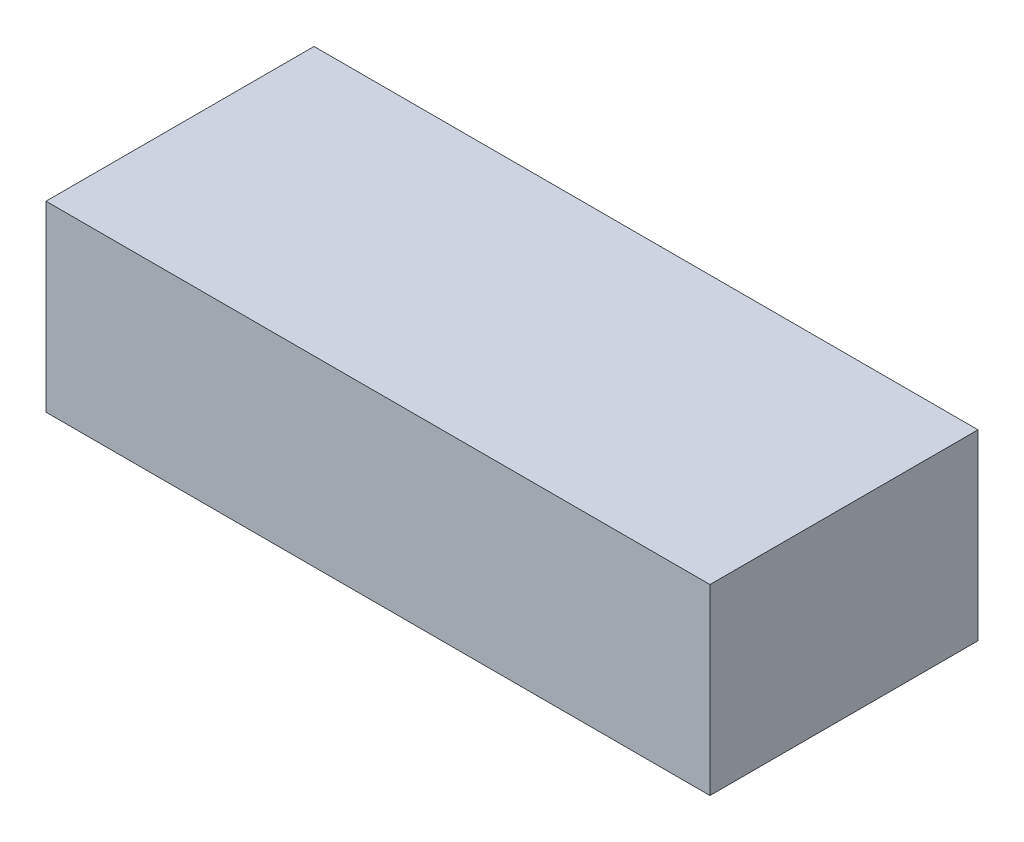
ISO-10303-21;
HEADER;
FILE_DESCRIPTION(('STEP AP214'),'2;1');
FILE_NAME('part.step','',(''),(''),'','','');
FILE_SCHEMA(('AUTOMOTIVE_DESIGN { 1 0 10303 214 1 1 1 1 }'));
ENDSEC;
DATA;
#1=APPLICATION_CONTEXT('core data for automotive mechanical design processes');
#2=APPLICATION_PROTOCOL_DEFINITION('international standard','automotive_design',2000,#1);
#3=PRODUCT_CONTEXT('',#1,'mechanical');
#4=PRODUCT('Part','Part','',(#3));
#5=PRODUCT_RELATED_PRODUCT_CATEGORY('part','',(#4));
#6=PRODUCT_DEFINITION_FORMATION('','',#4);
#7=PRODUCT_DEFINITION_CONTEXT('part definition',#1,'design');
#8=PRODUCT_DEFINITION('design','',#6,#7);
#9=PRODUCT_DEFINITION_SHAPE('','',#8);
#10=(LENGTH_UNIT() NAMED_UNIT(*) SI_UNIT(.MILLI.,.METRE.));
#11=(NAMED_UNIT(*) PLANE_ANGLE_UNIT() SI_UNIT($,.RADIAN.));
#12=(NAMED_UNIT(*) SI_UNIT($,.STERADIAN.) SOLID_ANGLE_UNIT());
#13=UNCERTAINTY_MEASURE_WITH_UNIT(LENGTH_MEASURE(1.E-05),#10,'distance_accuracy_value','');
#14=(GEOMETRIC_REPRESENTATION_CONTEXT(3) GLOBAL_UNCERTAINTY_ASSIGNED_CONTEXT((#13)) GLOBAL_UNIT_ASSIGNED_CONTEXT((#10,
#11,#12)) REPRESENTATION_CONTEXT('',''));
#15=CARTESIAN_POINT('',(0.,0.,0.));
#16=DIRECTION('',(0.,0.,1.));
#17=DIRECTION('',(1.,0.,0.));
#18=AXIS2_PLACEMENT_3D('',#15,#16,#17);
#19=CARTESIAN_POINT('',(0.,60.,0.));
#20=DIRECTION('',(1.,0.,0.));
#21=DIRECTION('',(0.,0.,-1.));
#22=AXIS2_PLACEMENT_3D('',#19,#20,#21);
#23=PLANE('',#22);
#24=DIRECTION('',(0.,0.,1.));
#25=VECTOR('',#24,1.);
#26=CARTESIAN_POINT('',(0.,0.,0.));
#27=LINE('',#26,#25);
#28=CARTESIAN_POINT('',(0.,0.,-88.));
#29=VERTEX_POINT('',#28);
#30=CARTESIAN_POINT('',(0.,0.,0.));
#31=VERTEX_POINT('',#30);
#32=EDGE_CURVE('E96',#29,#31,#27,.T.);
#33=ORIENTED_EDGE('',*,*,#32,.T.);
#34=DIRECTION('',(0.,-1.,0.));
#35=VECTOR('',#34,1.);
#36=CARTESIAN_POINT('',(0.,60.,0.));
#37=LINE('',#36,#35);
#38=CARTESIAN_POINT('',(0.,60.,0.));
#39=VERTEX_POINT('',#38);
#40=EDGE_CURVE('E11',#39,#31,#37,.T.);
#41=ORIENTED_EDGE('',*,*,#40,.F.);
#42=DIRECTION('',(0.,0.,1.));
#43=VECTOR('',#42,1.);
#44=CARTESIAN_POINT('',(0.,60.,0.));
#45=LINE('',#44,#43);
#46=CARTESIAN_POINT('',(0.,60.,-88.));
#47=VERTEX_POINT('',#46);
#48=EDGE_CURVE('E84',#47,#39,#45,.T.);
#49=ORIENTED_EDGE('',*,*,#48,.F.);
#50=DIRECTION('',(0.,-1.,0.));
#51=VECTOR('',#50,1.);
#52=CARTESIAN_POINT('',(0.,60.,-88.));
#53=LINE('',#52,#51);
#54=EDGE_CURVE('E92',#47,#29,#53,.T.);
#55=ORIENTED_EDGE('',*,*,#54,.T.);
#56=EDGE_LOOP('',(#33,#41,#49,#55));
#57=FACE_BOUND('',#56,.T.);
#58=ADVANCED_FACE('F33',(#57),#23,.F.);
#59=CARTESIAN_POINT('',(0.,60.,0.));
#60=DIRECTION('',(0.,0.,-1.));
#61=DIRECTION('',(-1.,0.,0.));
#62=AXIS2_PLACEMENT_3D('',#59,#60,#61);
#63=PLANE('',#62);
#64=DIRECTION('',(1.,0.,0.));
#65=VECTOR('',#64,1.);
#66=CARTESIAN_POINT('',(0.,0.,0.));
#67=LINE('',#66,#65);
#68=CARTESIAN_POINT('',(218.,0.,0.));
#69=VERTEX_POINT('',#68);
#70=EDGE_CURVE('E88',#31,#69,#67,.T.);
#71=ORIENTED_EDGE('',*,*,#70,.T.);
#72=DIRECTION('',(0.,-1.,0.));
#73=VECTOR('',#72,1.);
#74=CARTESIAN_POINT('',(218.,60.,0.));
#75=LINE('',#74,#73);
#76=CARTESIAN_POINT('',(218.,60.,0.));
#77=VERTEX_POINT('',#76);
#78=EDGE_CURVE('E41',#77,#69,#75,.T.);
#79=ORIENTED_EDGE('',*,*,#78,.F.);
#80=DIRECTION('',(1.,0.,0.));
#81=VECTOR('',#80,1.);
#82=CARTESIAN_POINT('',(0.,60.,0.));
#83=LINE('',#82,#81);
#84=EDGE_CURVE('E79',#39,#77,#83,.T.);
#85=ORIENTED_EDGE('',*,*,#84,.F.);
#86=ORIENTED_EDGE('',*,*,#40,.T.);
#87=EDGE_LOOP('',(#71,#79,#85,#86));
#88=FACE_BOUND('',#87,.T.);
#89=ADVANCED_FACE('F87',(#88),#63,.F.);
#90=CARTESIAN_POINT('',(218.,60.,0.));
#91=DIRECTION('',(-1.,0.,0.));
#92=DIRECTION('',(0.,0.,1.));
#93=AXIS2_PLACEMENT_3D('',#90,#91,#92);
#94=PLANE('',#93);
#95=DIRECTION('',(0.,0.,-1.));
#96=VECTOR('',#95,1.);
#97=CARTESIAN_POINT('',(218.,0.,0.));
#98=LINE('',#97,#96);
#99=CARTESIAN_POINT('',(218.,0.,-88.));
#100=VERTEX_POINT('',#99);
#101=EDGE_CURVE('E66',#69,#100,#98,.T.);
#102=ORIENTED_EDGE('',*,*,#101,.T.);
#103=DIRECTION('',(0.,-1.,0.));
#104=VECTOR('',#103,1.);
#105=CARTESIAN_POINT('',(218.,60.,-88.));
#106=LINE('',#105,#104);
#107=CARTESIAN_POINT('',(218.,60.,-88.));
#108=VERTEX_POINT('',#107);
#109=EDGE_CURVE('E89',#108,#100,#106,.T.);
#110=ORIENTED_EDGE('',*,*,#109,.F.);
#111=DIRECTION('',(0.,0.,-1.));
#112=VECTOR('',#111,1.);
#113=CARTESIAN_POINT('',(218.,60.,0.));
#114=LINE('',#113,#112);
#115=EDGE_CURVE('E82',#77,#108,#114,.T.);
#116=ORIENTED_EDGE('',*,*,#115,.F.);
#117=ORIENTED_EDGE('',*,*,#78,.T.);
#118=EDGE_LOOP('',(#102,#110,#116,#117));
#119=FACE_BOUND('',#118,.T.);
#120=ADVANCED_FACE('F90',(#119),#94,.F.);
#121=CARTESIAN_POINT('',(0.,60.,-88.));
#122=DIRECTION('',(0.,0.,1.));
#123=DIRECTION('',(1.,0.,0.));
#124=AXIS2_PLACEMENT_3D('',#121,#122,#123);
#125=PLANE('',#124);
#126=DIRECTION('',(-1.,0.,0.));
#127=VECTOR('',#126,1.);
#128=CARTESIAN_POINT('',(0.,0.,-88.));
#129=LINE('',#128,#127);
#130=EDGE_CURVE('E72',#100,#29,#129,.T.);
#131=ORIENTED_EDGE('',*,*,#130,.T.);
#132=ORIENTED_EDGE('',*,*,#54,.F.);
#133=DIRECTION('',(-1.,0.,0.));
#134=VECTOR('',#133,1.);
#135=CARTESIAN_POINT('',(0.,60.,-88.));
#136=LINE('',#135,#134);
#137=EDGE_CURVE('E49',#108,#47,#136,.T.);
#138=ORIENTED_EDGE('',*,*,#137,.F.);
#139=ORIENTED_EDGE('',*,*,#109,.T.);
#140=EDGE_LOOP('',(#131,#132,#138,#139));
#141=FACE_BOUND('',#140,.T.);
#142=ADVANCED_FACE('F103',(#141),#125,.F.);
#143=CARTESIAN_POINT('',(0.,60.,0.));
#144=DIRECTION('',(0.,-1.,0.));
#145=DIRECTION('',(0.,0.,-1.));
#146=AXIS2_PLACEMENT_3D('',#143,#144,#145);
#147=PLANE('',#146);
#148=ORIENTED_EDGE('',*,*,#48,.T.);
#149=ORIENTED_EDGE('',*,*,#84,.T.);
#150=ORIENTED_EDGE('',*,*,#115,.T.);
#151=ORIENTED_EDGE('',*,*,#137,.T.);
#152=EDGE_LOOP('',(#148,#149,#150,#151));
#153=FACE_BOUND('',#152,.T.);
#154=ADVANCED_FACE('F80',(#153),#147,.F.);
#155=CARTESIAN_POINT('',(0.,0.,0.));
#156=DIRECTION('',(0.,-1.,0.));
#157=DIRECTION('',(0.,0.,-1.));
#158=AXIS2_PLACEMENT_3D('',#155,#156,#157);
#159=PLANE('',#158);
#160=ORIENTED_EDGE('',*,*,#32,.F.);
#161=ORIENTED_EDGE('',*,*,#130,.F.);
#162=ORIENTED_EDGE('',*,*,#101,.F.);
#163=ORIENTED_EDGE('',*,*,#70,.F.);
#164=EDGE_LOOP('',(#160,#161,#162,#163));
#165=FACE_BOUND('',#164,.T.);
#166=ADVANCED_FACE('F106',(#165),#159,.T.);
#167=CLOSED_SHELL('',(#58,#89,#120,#142,#154,#166));
#168=MANIFOLD_SOLID_BREP('B2',#167);
#169=ADVANCED_BREP_SHAPE_REPRESENTATION('',(#18,#168),#14);
#170=SHAPE_DEFINITION_REPRESENTATION(#9,#169);
ENDSEC;
END-ISO-10303-21;
